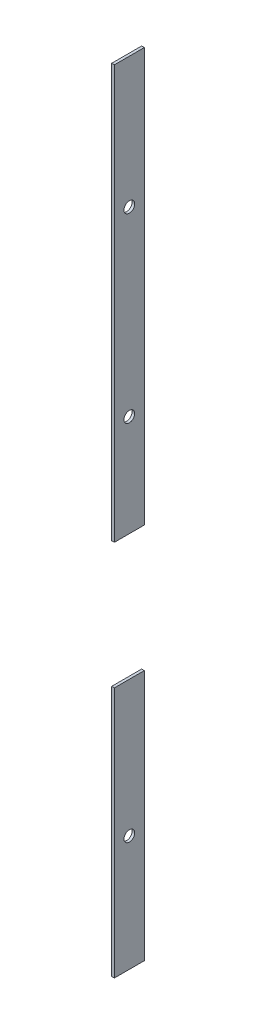
ISO-10303-21;
HEADER;
FILE_DESCRIPTION(('STEP AP214'),'2;1');
FILE_NAME('part.step','',(''),(''),'','','');
FILE_SCHEMA(('AUTOMOTIVE_DESIGN { 1 0 10303 214 1 1 1 1 }'));
ENDSEC;
DATA;
#1=APPLICATION_CONTEXT('core data for automotive mechanical design processes');
#2=APPLICATION_PROTOCOL_DEFINITION('international standard','automotive_design',2000,#1);
#3=PRODUCT_CONTEXT('',#1,'mechanical');
#4=PRODUCT('Part','Part','',(#3));
#5=PRODUCT_RELATED_PRODUCT_CATEGORY('part','',(#4));
#6=PRODUCT_DEFINITION_FORMATION('','',#4);
#7=PRODUCT_DEFINITION_CONTEXT('part definition',#1,'design');
#8=PRODUCT_DEFINITION('design','',#6,#7);
#9=PRODUCT_DEFINITION_SHAPE('','',#8);
#10=(LENGTH_UNIT() NAMED_UNIT(*) SI_UNIT(.MILLI.,.METRE.));
#11=(NAMED_UNIT(*) PLANE_ANGLE_UNIT() SI_UNIT($,.RADIAN.));
#12=(NAMED_UNIT(*) SI_UNIT($,.STERADIAN.) SOLID_ANGLE_UNIT());
#13=UNCERTAINTY_MEASURE_WITH_UNIT(LENGTH_MEASURE(1.E-05),#10,'distance_accuracy_value','');
#14=(GEOMETRIC_REPRESENTATION_CONTEXT(3) GLOBAL_UNCERTAINTY_ASSIGNED_CONTEXT((#13)) GLOBAL_UNIT_ASSIGNED_CONTEXT((#10,
#11,#12)) REPRESENTATION_CONTEXT('',''));
#15=CARTESIAN_POINT('',(0.,0.,0.));
#16=DIRECTION('',(0.,0.,1.));
#17=DIRECTION('',(1.,0.,0.));
#18=AXIS2_PLACEMENT_3D('',#15,#16,#17);
#19=CARTESIAN_POINT('',(1.5,0.,0.));
#20=DIRECTION('',(1.,0.,0.));
#21=DIRECTION('',(0.,0.,-1.));
#22=AXIS2_PLACEMENT_3D('',#19,#20,#21);
#23=PLANE('',#22);
#24=CARTESIAN_POINT('',(1.5,150.357641891011,326.786752094627));
#25=DIRECTION('',(1.,0.,0.));
#26=DIRECTION('',(0.,0.,-1.));
#27=AXIS2_PLACEMENT_3D('',#24,#25,#26);
#28=CIRCLE('',#27,2.99999999999999);
#29=CARTESIAN_POINT('',(1.5,150.357641891011,323.786752094627));
#30=VERTEX_POINT('',#29);
#31=EDGE_CURVE('E122',#30,#30,#28,.T.);
#32=ORIENTED_EDGE('',*,*,#31,.F.);
#33=EDGE_LOOP('',(#32));
#34=FACE_BOUND('',#33,.T.);
#35=DIRECTION('',(0.,-1.,0.));
#36=VECTOR('',#35,1.);
#37=CARTESIAN_POINT('',(1.5,223.430241891008,335.143752094618));
#38=LINE('',#37,#36);
#39=CARTESIAN_POINT('',(1.5,223.430241891008,335.143752094618));
#40=VERTEX_POINT('',#39);
#41=CARTESIAN_POINT('',(1.5,-7.99085135780629,335.143752094618));
#42=VERTEX_POINT('',#41);
#43=EDGE_CURVE('E115',#40,#42,#38,.T.);
#44=ORIENTED_EDGE('',*,*,#43,.T.);
#45=DIRECTION('',(0.,0.,-1.));
#46=VECTOR('',#45,1.);
#47=CARTESIAN_POINT('',(1.5,-7.99085135780629,335.143752094618));
#48=LINE('',#47,#46);
#49=CARTESIAN_POINT('',(1.5,-7.99085135780629,318.429752094618));
#50=VERTEX_POINT('',#49);
#51=EDGE_CURVE('E84',#42,#50,#48,.T.);
#52=ORIENTED_EDGE('',*,*,#51,.T.);
#53=DIRECTION('',(0.,1.,0.));
#54=VECTOR('',#53,1.);
#55=CARTESIAN_POINT('',(1.5,-7.99085135780629,318.429752094618));
#56=LINE('',#55,#54);
#57=CARTESIAN_POINT('',(1.5,223.430241891008,318.429752094618));
#58=VERTEX_POINT('',#57);
#59=EDGE_CURVE('E124',#50,#58,#56,.T.);
#60=ORIENTED_EDGE('',*,*,#59,.T.);
#61=DIRECTION('',(0.,0.,1.));
#62=VECTOR('',#61,1.);
#63=CARTESIAN_POINT('',(1.5,223.430241891008,318.429752094618));
#64=LINE('',#63,#62);
#65=EDGE_CURVE('E108',#58,#40,#64,.T.);
#66=ORIENTED_EDGE('',*,*,#65,.T.);
#67=EDGE_LOOP('',(#44,#52,#60,#66));
#68=FACE_BOUND('',#67,.T.);
#69=CARTESIAN_POINT('',(1.5,48.7576418910106,326.78675209462));
#70=DIRECTION('',(1.,0.,0.));
#71=DIRECTION('',(0.,0.,-1.));
#72=AXIS2_PLACEMENT_3D('',#69,#70,#71);
#73=CIRCLE('',#72,2.99999999999999);
#74=CARTESIAN_POINT('',(1.5,48.7576418910106,323.78675209462));
#75=VERTEX_POINT('',#74);
#76=EDGE_CURVE('E55',#75,#75,#73,.T.);
#77=ORIENTED_EDGE('',*,*,#76,.F.);
#78=EDGE_LOOP('',(#77));
#79=FACE_BOUND('',#78,.T.);
#80=ADVANCED_FACE('F51',(#34,#68,#79),#23,.T.);
#81=CARTESIAN_POINT('',(0.,0.,0.));
#82=DIRECTION('',(1.,0.,0.));
#83=DIRECTION('',(0.,0.,-1.));
#84=AXIS2_PLACEMENT_3D('',#81,#82,#83);
#85=PLANE('',#84);
#86=DIRECTION('',(0.,-1.,0.));
#87=VECTOR('',#86,1.);
#88=CARTESIAN_POINT('',(0.,223.430241891008,335.143752094618));
#89=LINE('',#88,#87);
#90=CARTESIAN_POINT('',(0.,223.430241891008,335.143752094618));
#91=VERTEX_POINT('',#90);
#92=CARTESIAN_POINT('',(0.,-7.99085135780629,335.143752094618));
#93=VERTEX_POINT('',#92);
#94=EDGE_CURVE('E114',#91,#93,#89,.T.);
#95=ORIENTED_EDGE('',*,*,#94,.F.);
#96=DIRECTION('',(0.,0.,1.));
#97=VECTOR('',#96,1.);
#98=CARTESIAN_POINT('',(0.,223.430241891008,318.429752094618));
#99=LINE('',#98,#97);
#100=CARTESIAN_POINT('',(0.,223.430241891008,318.429752094618));
#101=VERTEX_POINT('',#100);
#102=EDGE_CURVE('E94',#101,#91,#99,.T.);
#103=ORIENTED_EDGE('',*,*,#102,.F.);
#104=DIRECTION('',(0.,1.,0.));
#105=VECTOR('',#104,1.);
#106=CARTESIAN_POINT('',(0.,-7.99085135780629,318.429752094618));
#107=LINE('',#106,#105);
#108=CARTESIAN_POINT('',(0.,-7.99085135780629,318.429752094618));
#109=VERTEX_POINT('',#108);
#110=EDGE_CURVE('E100',#109,#101,#107,.T.);
#111=ORIENTED_EDGE('',*,*,#110,.F.);
#112=DIRECTION('',(0.,0.,-1.));
#113=VECTOR('',#112,1.);
#114=CARTESIAN_POINT('',(0.,-7.99085135780629,335.143752094618));
#115=LINE('',#114,#113);
#116=EDGE_CURVE('E68',#93,#109,#115,.T.);
#117=ORIENTED_EDGE('',*,*,#116,.F.);
#118=EDGE_LOOP('',(#95,#103,#111,#117));
#119=FACE_BOUND('',#118,.T.);
#120=CARTESIAN_POINT('',(0.,150.357641891011,326.786752094627));
#121=DIRECTION('',(1.,0.,0.));
#122=DIRECTION('',(0.,0.,-1.));
#123=AXIS2_PLACEMENT_3D('',#120,#121,#122);
#124=CIRCLE('',#123,2.99999999999999);
#125=CARTESIAN_POINT('',(0.,150.357641891011,323.786752094627));
#126=VERTEX_POINT('',#125);
#127=EDGE_CURVE('E127',#126,#126,#124,.T.);
#128=ORIENTED_EDGE('',*,*,#127,.T.);
#129=EDGE_LOOP('',(#128));
#130=FACE_BOUND('',#129,.T.);
#131=CARTESIAN_POINT('',(0.,48.7576418910106,326.78675209462));
#132=DIRECTION('',(1.,0.,0.));
#133=DIRECTION('',(0.,0.,-1.));
#134=AXIS2_PLACEMENT_3D('',#131,#132,#133);
#135=CIRCLE('',#134,2.99999999999999);
#136=CARTESIAN_POINT('',(0.,48.7576418910106,323.78675209462));
#137=VERTEX_POINT('',#136);
#138=EDGE_CURVE('E12',#137,#137,#135,.T.);
#139=ORIENTED_EDGE('',*,*,#138,.T.);
#140=EDGE_LOOP('',(#139));
#141=FACE_BOUND('',#140,.T.);
#142=ADVANCED_FACE('F111',(#119,#130,#141),#85,.F.);
#143=CARTESIAN_POINT('',(1.5,223.430241891008,335.143752094618));
#144=DIRECTION('',(0.,0.,-1.));
#145=DIRECTION('',(-1.,0.,0.));
#146=AXIS2_PLACEMENT_3D('',#143,#144,#145);
#147=PLANE('',#146);
#148=ORIENTED_EDGE('',*,*,#94,.T.);
#149=DIRECTION('',(-1.,0.,0.));
#150=VECTOR('',#149,1.);
#151=CARTESIAN_POINT('',(1.5,-7.99085135780629,335.143752094618));
#152=LINE('',#151,#150);
#153=EDGE_CURVE('E172',#42,#93,#152,.T.);
#154=ORIENTED_EDGE('',*,*,#153,.F.);
#155=ORIENTED_EDGE('',*,*,#43,.F.);
#156=DIRECTION('',(-1.,0.,0.));
#157=VECTOR('',#156,1.);
#158=CARTESIAN_POINT('',(1.5,223.430241891008,335.143752094618));
#159=LINE('',#158,#157);
#160=EDGE_CURVE('E109',#40,#91,#159,.T.);
#161=ORIENTED_EDGE('',*,*,#160,.T.);
#162=EDGE_LOOP('',(#148,#154,#155,#161));
#163=FACE_BOUND('',#162,.T.);
#164=ADVANCED_FACE('F149',(#163),#147,.F.);
#165=CARTESIAN_POINT('',(1.5,-7.99085135780629,335.143752094618));
#166=DIRECTION('',(0.,1.,0.));
#167=DIRECTION('',(0.,0.,1.));
#168=AXIS2_PLACEMENT_3D('',#165,#166,#167);
#169=PLANE('',#168);
#170=ORIENTED_EDGE('',*,*,#116,.T.);
#171=DIRECTION('',(-1.,0.,0.));
#172=VECTOR('',#171,1.);
#173=CARTESIAN_POINT('',(1.5,-7.99085135780629,318.429752094618));
#174=LINE('',#173,#172);
#175=EDGE_CURVE('E105',#50,#109,#174,.T.);
#176=ORIENTED_EDGE('',*,*,#175,.F.);
#177=ORIENTED_EDGE('',*,*,#51,.F.);
#178=ORIENTED_EDGE('',*,*,#153,.T.);
#179=EDGE_LOOP('',(#170,#176,#177,#178));
#180=FACE_BOUND('',#179,.T.);
#181=ADVANCED_FACE('F154',(#180),#169,.F.);
#182=CARTESIAN_POINT('',(1.5,-7.99085135780629,318.429752094618));
#183=DIRECTION('',(0.,0.,1.));
#184=DIRECTION('',(1.,0.,0.));
#185=AXIS2_PLACEMENT_3D('',#182,#183,#184);
#186=PLANE('',#185);
#187=ORIENTED_EDGE('',*,*,#110,.T.);
#188=DIRECTION('',(-1.,0.,0.));
#189=VECTOR('',#188,1.);
#190=CARTESIAN_POINT('',(1.5,223.430241891008,318.429752094618));
#191=LINE('',#190,#189);
#192=EDGE_CURVE('E103',#58,#101,#191,.T.);
#193=ORIENTED_EDGE('',*,*,#192,.F.);
#194=ORIENTED_EDGE('',*,*,#59,.F.);
#195=ORIENTED_EDGE('',*,*,#175,.T.);
#196=EDGE_LOOP('',(#187,#193,#194,#195));
#197=FACE_BOUND('',#196,.T.);
#198=ADVANCED_FACE('F101',(#197),#186,.F.);
#199=CARTESIAN_POINT('',(1.5,223.430241891008,318.429752094618));
#200=DIRECTION('',(0.,-1.,0.));
#201=DIRECTION('',(0.,0.,-1.));
#202=AXIS2_PLACEMENT_3D('',#199,#200,#201);
#203=PLANE('',#202);
#204=ORIENTED_EDGE('',*,*,#102,.T.);
#205=ORIENTED_EDGE('',*,*,#160,.F.);
#206=ORIENTED_EDGE('',*,*,#65,.F.);
#207=ORIENTED_EDGE('',*,*,#192,.T.);
#208=EDGE_LOOP('',(#204,#205,#206,#207));
#209=FACE_BOUND('',#208,.T.);
#210=ADVANCED_FACE('F107',(#209),#203,.F.);
#211=CARTESIAN_POINT('',(1.5,150.357641891011,326.786752094627));
#212=DIRECTION('',(-1.,0.,0.));
#213=DIRECTION('',(0.,0.,1.));
#214=AXIS2_PLACEMENT_3D('',#211,#212,#213);
#215=CYLINDRICAL_SURFACE('',#214,2.99999999999999);
#216=ORIENTED_EDGE('',*,*,#31,.T.);
#217=EDGE_LOOP('',(#216));
#218=FACE_BOUND('',#217,.T.);
#219=ORIENTED_EDGE('',*,*,#127,.F.);
#220=EDGE_LOOP('',(#219));
#221=FACE_BOUND('',#220,.T.);
#222=ADVANCED_FACE('F133',(#218,#221),#215,.F.);
#223=CARTESIAN_POINT('',(1.5,48.7576418910106,326.78675209462));
#224=DIRECTION('',(-1.,0.,0.));
#225=DIRECTION('',(0.,0.,1.));
#226=AXIS2_PLACEMENT_3D('',#223,#224,#225);
#227=CYLINDRICAL_SURFACE('',#226,2.99999999999999);
#228=ORIENTED_EDGE('',*,*,#76,.T.);
#229=EDGE_LOOP('',(#228));
#230=FACE_BOUND('',#229,.T.);
#231=ORIENTED_EDGE('',*,*,#138,.F.);
#232=EDGE_LOOP('',(#231));
#233=FACE_BOUND('',#232,.T.);
#234=ADVANCED_FACE('F53',(#230,#233),#227,.F.);
#235=CLOSED_SHELL('',(#80,#142,#164,#181,#198,#210,#222,#234));
#236=MANIFOLD_SOLID_BREP('B2',#235);
#237=CARTESIAN_POINT('',(1.5,0.,0.));
#238=DIRECTION('',(1.,0.,0.));
#239=DIRECTION('',(0.,0.,-1.));
#240=AXIS2_PLACEMENT_3D('',#237,#238,#239);
#241=PLANE('',#240);
#242=DIRECTION('',(0.,1.,0.));
#243=VECTOR('',#242,1.);
#244=CARTESIAN_POINT('',(1.5,-219.134944622619,318.429752094618));
#245=LINE('',#244,#243);
#246=CARTESIAN_POINT('',(1.5,-219.134944622619,318.429752094618));
#247=VERTEX_POINT('',#246);
#248=CARTESIAN_POINT('',(1.5,-78.5158513578063,318.429752094618));
#249=VERTEX_POINT('',#248);
#250=EDGE_CURVE('E269',#247,#249,#245,.T.);
#251=ORIENTED_EDGE('',*,*,#250,.T.);
#252=DIRECTION('',(0.,0.,1.));
#253=VECTOR('',#252,1.);
#254=CARTESIAN_POINT('',(1.5,-78.5158513578063,318.429752094618));
#255=LINE('',#254,#253);
#256=CARTESIAN_POINT('',(1.5,-78.5158513578063,335.143752094619));
#257=VERTEX_POINT('',#256);
#258=EDGE_CURVE('E264',#249,#257,#255,.T.);
#259=ORIENTED_EDGE('',*,*,#258,.T.);
#260=DIRECTION('',(0.,-1.,0.));
#261=VECTOR('',#260,1.);
#262=CARTESIAN_POINT('',(1.5,-78.5158513578063,335.143752094619));
#263=LINE('',#262,#261);
#264=CARTESIAN_POINT('',(1.5,-219.134944622619,335.143752094618));
#265=VERTEX_POINT('',#264);
#266=EDGE_CURVE('E267',#257,#265,#263,.T.);
#267=ORIENTED_EDGE('',*,*,#266,.T.);
#268=DIRECTION('',(0.,0.,-1.));
#269=VECTOR('',#268,1.);
#270=CARTESIAN_POINT('',(1.5,-219.134944622619,335.143752094618));
#271=LINE('',#270,#269);
#272=EDGE_CURVE('E234',#265,#247,#271,.T.);
#273=ORIENTED_EDGE('',*,*,#272,.T.);
#274=EDGE_LOOP('',(#251,#259,#267,#273));
#275=FACE_BOUND('',#274,.T.);
#276=CARTESIAN_POINT('',(1.5,-154.442358108989,326.786752094628));
#277=DIRECTION('',(1.,0.,0.));
#278=DIRECTION('',(0.,0.,-1.));
#279=AXIS2_PLACEMENT_3D('',#276,#277,#278);
#280=CIRCLE('',#279,2.99999999999999);
#281=CARTESIAN_POINT('',(1.5,-154.442358108989,323.786752094628));
#282=VERTEX_POINT('',#281);
#283=EDGE_CURVE('E284',#282,#282,#280,.T.);
#284=ORIENTED_EDGE('',*,*,#283,.F.);
#285=EDGE_LOOP('',(#284));
#286=FACE_BOUND('',#285,.T.);
#287=ADVANCED_FACE('F217',(#275,#286),#241,.T.);
#288=CARTESIAN_POINT('',(0.,0.,0.));
#289=DIRECTION('',(1.,0.,0.));
#290=DIRECTION('',(0.,0.,-1.));
#291=AXIS2_PLACEMENT_3D('',#288,#289,#290);
#292=PLANE('',#291);
#293=DIRECTION('',(0.,1.,0.));
#294=VECTOR('',#293,1.);
#295=CARTESIAN_POINT('',(0.,-219.134944622619,318.429752094618));
#296=LINE('',#295,#294);
#297=CARTESIAN_POINT('',(0.,-219.134944622619,318.429752094618));
#298=VERTEX_POINT('',#297);
#299=CARTESIAN_POINT('',(0.,-78.5158513578063,318.429752094618));
#300=VERTEX_POINT('',#299);
#301=EDGE_CURVE('E281',#298,#300,#296,.T.);
#302=ORIENTED_EDGE('',*,*,#301,.F.);
#303=DIRECTION('',(0.,0.,-1.));
#304=VECTOR('',#303,1.);
#305=CARTESIAN_POINT('',(0.,-219.134944622619,335.143752094618));
#306=LINE('',#305,#304);
#307=CARTESIAN_POINT('',(0.,-219.134944622619,335.143752094618));
#308=VERTEX_POINT('',#307);
#309=EDGE_CURVE('E257',#308,#298,#306,.T.);
#310=ORIENTED_EDGE('',*,*,#309,.F.);
#311=DIRECTION('',(0.,-1.,0.));
#312=VECTOR('',#311,1.);
#313=CARTESIAN_POINT('',(0.,-78.5158513578063,335.143752094619));
#314=LINE('',#313,#312);
#315=CARTESIAN_POINT('',(0.,-78.5158513578063,335.143752094619));
#316=VERTEX_POINT('',#315);
#317=EDGE_CURVE('E251',#316,#308,#314,.T.);
#318=ORIENTED_EDGE('',*,*,#317,.F.);
#319=DIRECTION('',(0.,0.,1.));
#320=VECTOR('',#319,1.);
#321=CARTESIAN_POINT('',(0.,-78.5158513578063,318.429752094618));
#322=LINE('',#321,#320);
#323=EDGE_CURVE('E273',#300,#316,#322,.T.);
#324=ORIENTED_EDGE('',*,*,#323,.F.);
#325=EDGE_LOOP('',(#302,#310,#318,#324));
#326=FACE_BOUND('',#325,.T.);
#327=CARTESIAN_POINT('',(0.,-154.442358108989,326.786752094628));
#328=DIRECTION('',(1.,0.,0.));
#329=DIRECTION('',(0.,0.,-1.));
#330=AXIS2_PLACEMENT_3D('',#327,#328,#329);
#331=CIRCLE('',#330,2.99999999999999);
#332=CARTESIAN_POINT('',(0.,-154.442358108989,323.786752094628));
#333=VERTEX_POINT('',#332);
#334=EDGE_CURVE('E296',#333,#333,#331,.T.);
#335=ORIENTED_EDGE('',*,*,#334,.T.);
#336=EDGE_LOOP('',(#335));
#337=FACE_BOUND('',#336,.T.);
#338=ADVANCED_FACE('F292',(#326,#337),#292,.F.);
#339=CARTESIAN_POINT('',(1.5,-219.134944622619,318.429752094618));
#340=DIRECTION('',(0.,0.,1.));
#341=DIRECTION('',(1.,0.,0.));
#342=AXIS2_PLACEMENT_3D('',#339,#340,#341);
#343=PLANE('',#342);
#344=ORIENTED_EDGE('',*,*,#301,.T.);
#345=DIRECTION('',(-1.,0.,0.));
#346=VECTOR('',#345,1.);
#347=CARTESIAN_POINT('',(1.5,-78.5158513578063,318.429752094618));
#348=LINE('',#347,#346);
#349=EDGE_CURVE('E49',#249,#300,#348,.T.);
#350=ORIENTED_EDGE('',*,*,#349,.F.);
#351=ORIENTED_EDGE('',*,*,#250,.F.);
#352=DIRECTION('',(-1.,0.,0.));
#353=VECTOR('',#352,1.);
#354=CARTESIAN_POINT('',(1.5,-219.134944622619,318.429752094618));
#355=LINE('',#354,#353);
#356=EDGE_CURVE('E277',#247,#298,#355,.T.);
#357=ORIENTED_EDGE('',*,*,#356,.T.);
#358=EDGE_LOOP('',(#344,#350,#351,#357));
#359=FACE_BOUND('',#358,.T.);
#360=ADVANCED_FACE('F219',(#359),#343,.F.);
#361=CARTESIAN_POINT('',(1.5,-78.5158513578063,318.429752094618));
#362=DIRECTION('',(0.,-1.,0.));
#363=DIRECTION('',(0.,0.,-1.));
#364=AXIS2_PLACEMENT_3D('',#361,#362,#363);
#365=PLANE('',#364);
#366=ORIENTED_EDGE('',*,*,#323,.T.);
#367=DIRECTION('',(-1.,0.,0.));
#368=VECTOR('',#367,1.);
#369=CARTESIAN_POINT('',(1.5,-78.5158513578063,335.143752094619));
#370=LINE('',#369,#368);
#371=EDGE_CURVE('E226',#257,#316,#370,.T.);
#372=ORIENTED_EDGE('',*,*,#371,.F.);
#373=ORIENTED_EDGE('',*,*,#258,.F.);
#374=ORIENTED_EDGE('',*,*,#349,.T.);
#375=EDGE_LOOP('',(#366,#372,#373,#374));
#376=FACE_BOUND('',#375,.T.);
#377=ADVANCED_FACE('F272',(#376),#365,.F.);
#378=CARTESIAN_POINT('',(1.5,-78.5158513578063,335.143752094619));
#379=DIRECTION('',(0.,0.,-1.));
#380=DIRECTION('',(0.,1.,0.));
#381=AXIS2_PLACEMENT_3D('',#378,#379,#380);
#382=PLANE('',#381);
#383=ORIENTED_EDGE('',*,*,#317,.T.);
#384=DIRECTION('',(-1.,0.,0.));
#385=VECTOR('',#384,1.);
#386=CARTESIAN_POINT('',(1.5,-219.134944622619,335.143752094618));
#387=LINE('',#386,#385);
#388=EDGE_CURVE('E274',#265,#308,#387,.T.);
#389=ORIENTED_EDGE('',*,*,#388,.F.);
#390=ORIENTED_EDGE('',*,*,#266,.F.);
#391=ORIENTED_EDGE('',*,*,#371,.T.);
#392=EDGE_LOOP('',(#383,#389,#390,#391));
#393=FACE_BOUND('',#392,.T.);
#394=ADVANCED_FACE('F275',(#393),#382,.F.);
#395=CARTESIAN_POINT('',(1.5,-219.134944622619,335.143752094618));
#396=DIRECTION('',(0.,1.,0.));
#397=DIRECTION('',(0.,0.,1.));
#398=AXIS2_PLACEMENT_3D('',#395,#396,#397);
#399=PLANE('',#398);
#400=ORIENTED_EDGE('',*,*,#309,.T.);
#401=ORIENTED_EDGE('',*,*,#356,.F.);
#402=ORIENTED_EDGE('',*,*,#272,.F.);
#403=ORIENTED_EDGE('',*,*,#388,.T.);
#404=EDGE_LOOP('',(#400,#401,#402,#403));
#405=FACE_BOUND('',#404,.T.);
#406=ADVANCED_FACE('F289',(#405),#399,.F.);
#407=CARTESIAN_POINT('',(1.5,-154.442358108989,326.786752094628));
#408=DIRECTION('',(-1.,0.,0.));
#409=DIRECTION('',(0.,0.,1.));
#410=AXIS2_PLACEMENT_3D('',#407,#408,#409);
#411=CYLINDRICAL_SURFACE('',#410,2.99999999999999);
#412=ORIENTED_EDGE('',*,*,#283,.T.);
#413=EDGE_LOOP('',(#412));
#414=FACE_BOUND('',#413,.T.);
#415=ORIENTED_EDGE('',*,*,#334,.F.);
#416=EDGE_LOOP('',(#415));
#417=FACE_BOUND('',#416,.T.);
#418=ADVANCED_FACE('F302',(#414,#417),#411,.F.);
#419=CLOSED_SHELL('',(#287,#338,#360,#377,#394,#406,#418));
#420=MANIFOLD_SOLID_BREP('B6',#419);
#421=ADVANCED_BREP_SHAPE_REPRESENTATION('',(#18,#236,#420),#14);
#422=SHAPE_DEFINITION_REPRESENTATION(#9,#421);
ENDSEC;
END-ISO-10303-21;
